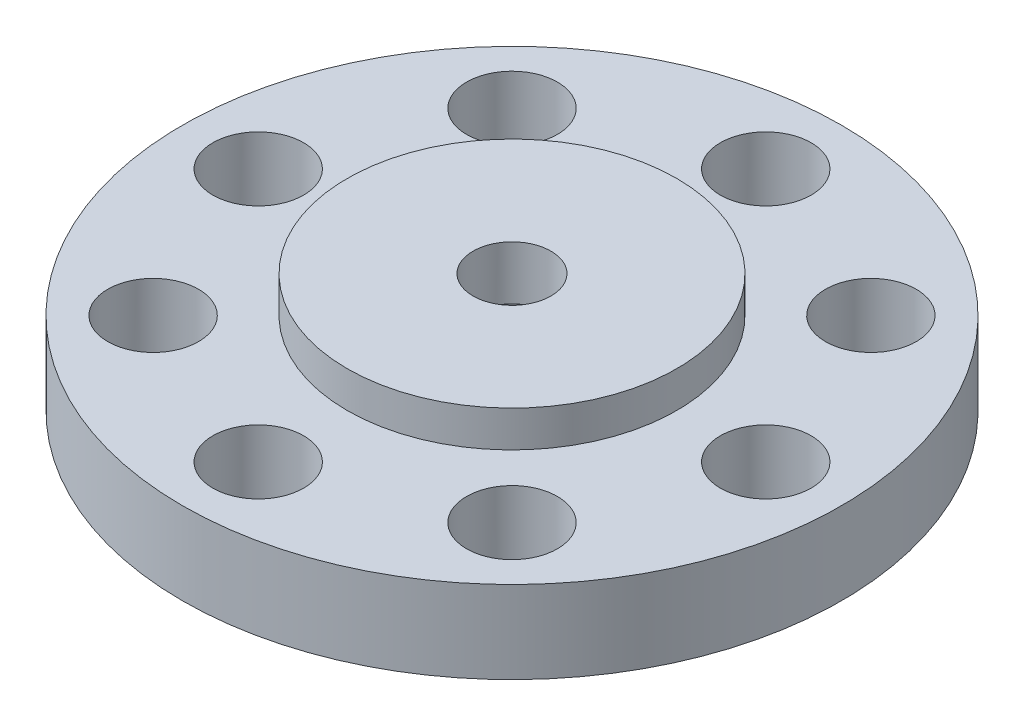
ISO-10303-21;
HEADER;
FILE_DESCRIPTION(('STEP AP214'),'2;1');
FILE_NAME('part.step','',(''),(''),'','','');
FILE_SCHEMA(('AUTOMOTIVE_DESIGN { 1 0 10303 214 1 1 1 1 }'));
ENDSEC;
DATA;
#1=APPLICATION_CONTEXT('core data for automotive mechanical design processes');
#2=APPLICATION_PROTOCOL_DEFINITION('international standard','automotive_design',2000,#1);
#3=PRODUCT_CONTEXT('',#1,'mechanical');
#4=PRODUCT('Part','Part','',(#3));
#5=PRODUCT_RELATED_PRODUCT_CATEGORY('part','',(#4));
#6=PRODUCT_DEFINITION_FORMATION('','',#4);
#7=PRODUCT_DEFINITION_CONTEXT('part definition',#1,'design');
#8=PRODUCT_DEFINITION('design','',#6,#7);
#9=PRODUCT_DEFINITION_SHAPE('','',#8);
#10=(LENGTH_UNIT() NAMED_UNIT(*) SI_UNIT(.MILLI.,.METRE.));
#11=(NAMED_UNIT(*) PLANE_ANGLE_UNIT() SI_UNIT($,.RADIAN.));
#12=(NAMED_UNIT(*) SI_UNIT($,.STERADIAN.) SOLID_ANGLE_UNIT());
#13=UNCERTAINTY_MEASURE_WITH_UNIT(LENGTH_MEASURE(1.E-05),#10,'distance_accuracy_value','');
#14=(GEOMETRIC_REPRESENTATION_CONTEXT(3) GLOBAL_UNCERTAINTY_ASSIGNED_CONTEXT((#13)) GLOBAL_UNIT_ASSIGNED_CONTEXT((#10,
#11,#12)) REPRESENTATION_CONTEXT('',''));
#15=CARTESIAN_POINT('',(0.,0.,0.));
#16=DIRECTION('',(0.,0.,1.));
#17=DIRECTION('',(1.,0.,0.));
#18=AXIS2_PLACEMENT_3D('',#15,#16,#17);
#19=CARTESIAN_POINT('',(0.,-3.175,0.));
#20=DIRECTION('',(0.,1.,0.));
#21=DIRECTION('',(0.,0.,1.));
#22=AXIS2_PLACEMENT_3D('',#19,#20,#21);
#23=CYLINDRICAL_SURFACE('',#22,1.5);
#24=CARTESIAN_POINT('',(0.,1.397,0.));
#25=DIRECTION('',(0.,1.,0.));
#26=DIRECTION('',(0.,0.,1.));
#27=AXIS2_PLACEMENT_3D('',#24,#25,#26);
#28=CIRCLE('',#27,1.5);
#29=CARTESIAN_POINT('',(0.,1.397,1.5));
#30=VERTEX_POINT('',#29);
#31=EDGE_CURVE('E60',#30,#30,#28,.T.);
#32=ORIENTED_EDGE('',*,*,#31,.T.);
#33=EDGE_LOOP('',(#32));
#34=FACE_BOUND('',#33,.T.);
#35=CARTESIAN_POINT('',(0.,-0.675,0.));
#36=DIRECTION('',(0.,-1.,0.));
#37=DIRECTION('',(0.,0.,-1.));
#38=AXIS2_PLACEMENT_3D('',#35,#36,#37);
#39=CIRCLE('',#38,1.5);
#40=CARTESIAN_POINT('',(0.,-0.675,-1.5));
#41=VERTEX_POINT('',#40);
#42=EDGE_CURVE('E43',#41,#41,#39,.F.);
#43=ORIENTED_EDGE('',*,*,#42,.F.);
#44=EDGE_LOOP('',(#43));
#45=FACE_BOUND('',#44,.T.);
#46=ADVANCED_FACE('F39',(#34,#45),#23,.F.);
#47=CARTESIAN_POINT('',(0.,-3.175,0.));
#48=DIRECTION('',(0.,1.,0.));
#49=DIRECTION('',(0.,0.,1.));
#50=AXIS2_PLACEMENT_3D('',#47,#48,#49);
#51=CYLINDRICAL_SURFACE('',#50,12.7);
#52=CARTESIAN_POINT('',(0.,-3.175,0.));
#53=DIRECTION('',(0.,1.,0.));
#54=DIRECTION('',(0.,0.,1.));
#55=AXIS2_PLACEMENT_3D('',#52,#53,#54);
#56=CIRCLE('',#55,12.7);
#57=CARTESIAN_POINT('',(0.,-3.175,12.7));
#58=VERTEX_POINT('',#57);
#59=EDGE_CURVE('E47',#58,#58,#56,.T.);
#60=ORIENTED_EDGE('',*,*,#59,.T.);
#61=EDGE_LOOP('',(#60));
#62=FACE_BOUND('',#61,.T.);
#63=CARTESIAN_POINT('',(0.,0.,0.));
#64=DIRECTION('',(0.,1.,0.));
#65=DIRECTION('',(0.,0.,1.));
#66=AXIS2_PLACEMENT_3D('',#63,#64,#65);
#67=CIRCLE('',#66,12.7);
#68=CARTESIAN_POINT('',(0.,0.,12.7));
#69=VERTEX_POINT('',#68);
#70=EDGE_CURVE('E52',#69,#69,#67,.T.);
#71=ORIENTED_EDGE('',*,*,#70,.F.);
#72=EDGE_LOOP('',(#71));
#73=FACE_BOUND('',#72,.T.);
#74=ADVANCED_FACE('F41',(#62,#73),#51,.T.);
#75=CARTESIAN_POINT('',(0.,-3.175,0.));
#76=DIRECTION('',(0.,1.,0.));
#77=DIRECTION('',(0.,0.,1.));
#78=AXIS2_PLACEMENT_3D('',#75,#76,#77);
#79=PLANE('',#78);
#80=CARTESIAN_POINT('',(0.,-3.175,0.));
#81=DIRECTION('',(0.,-1.,0.));
#82=DIRECTION('',(0.,0.,-1.));
#83=AXIS2_PLACEMENT_3D('',#80,#81,#82);
#84=CIRCLE('',#83,2.5);
#85=CARTESIAN_POINT('',(0.,-3.175,-2.5));
#86=VERTEX_POINT('',#85);
#87=EDGE_CURVE('E113',#86,#86,#84,.T.);
#88=ORIENTED_EDGE('',*,*,#87,.F.);
#89=EDGE_LOOP('',(#88));
#90=FACE_BOUND('',#89,.T.);
#91=CARTESIAN_POINT('',(-9.779,-3.175,0.));
#92=DIRECTION('',(0.,1.,0.));
#93=DIRECTION('',(-1.,0.,0.));
#94=AXIS2_PLACEMENT_3D('',#91,#92,#93);
#95=CIRCLE('',#94,1.75);
#96=CARTESIAN_POINT('',(-11.529,-3.175,0.));
#97=VERTEX_POINT('',#96);
#98=EDGE_CURVE('E95',#97,#97,#95,.T.);
#99=ORIENTED_EDGE('',*,*,#98,.T.);
#100=EDGE_LOOP('',(#99));
#101=FACE_BOUND('',#100,.T.);
#102=CARTESIAN_POINT('',(-6.91479721322321,-3.175,-6.91479721322328));
#103=DIRECTION('',(0.,1.,0.));
#104=DIRECTION('',(-0.707106781186544,0.,-0.707106781186551));
#105=AXIS2_PLACEMENT_3D('',#102,#103,#104);
#106=CIRCLE('',#105,1.75);
#107=CARTESIAN_POINT('',(-8.15223408029966,-3.175,-8.15223408029975));
#108=VERTEX_POINT('',#107);
#109=EDGE_CURVE('E103',#108,#108,#106,.T.);
#110=ORIENTED_EDGE('',*,*,#109,.T.);
#111=EDGE_LOOP('',(#110));
#112=FACE_BOUND('',#111,.T.);
#113=CARTESIAN_POINT('',(0.,-3.175,-9.779));
#114=DIRECTION('',(0.,1.,0.));
#115=DIRECTION('',(0.,0.,-1.));
#116=AXIS2_PLACEMENT_3D('',#113,#114,#115);
#117=CIRCLE('',#116,1.75);
#118=CARTESIAN_POINT('',(0.,-3.175,-11.529));
#119=VERTEX_POINT('',#118);
#120=EDGE_CURVE('E99',#119,#119,#117,.T.);
#121=ORIENTED_EDGE('',*,*,#120,.T.);
#122=EDGE_LOOP('',(#121));
#123=FACE_BOUND('',#122,.T.);
#124=CARTESIAN_POINT('',(6.91479721322331,-3.175,-6.91479721322319));
#125=DIRECTION('',(0.,1.,0.));
#126=DIRECTION('',(0.707106781186554,0.,-0.707106781186541));
#127=AXIS2_PLACEMENT_3D('',#124,#125,#126);
#128=CIRCLE('',#127,1.75);
#129=CARTESIAN_POINT('',(8.15223408029978,-3.175,-8.15223408029964));
#130=VERTEX_POINT('',#129);
#131=EDGE_CURVE('E96',#130,#130,#128,.T.);
#132=ORIENTED_EDGE('',*,*,#131,.T.);
#133=EDGE_LOOP('',(#132));
#134=FACE_BOUND('',#133,.T.);
#135=CARTESIAN_POINT('',(9.779,-3.175,1.02429588037641E-13));
#136=DIRECTION('',(0.,1.,0.));
#137=DIRECTION('',(1.,0.,0.));
#138=AXIS2_PLACEMENT_3D('',#135,#136,#137);
#139=CIRCLE('',#138,1.75);
#140=CARTESIAN_POINT('',(11.529,-3.175,1.20759865066567E-13));
#141=VERTEX_POINT('',#140);
#142=EDGE_CURVE('E100',#141,#141,#139,.T.);
#143=ORIENTED_EDGE('',*,*,#142,.T.);
#144=EDGE_LOOP('',(#143));
#145=FACE_BOUND('',#144,.T.);
#146=CARTESIAN_POINT('',(6.91479721322316,-3.175,6.91479721322333));
#147=DIRECTION('',(0.,1.,0.));
#148=DIRECTION('',(0.707106781186539,0.,0.707106781186556));
#149=AXIS2_PLACEMENT_3D('',#146,#147,#148);
#150=CIRCLE('',#149,1.75);
#151=CARTESIAN_POINT('',(8.15223408029961,-3.175,8.1522340802998));
#152=VERTEX_POINT('',#151);
#153=EDGE_CURVE('E108',#152,#152,#150,.T.);
#154=ORIENTED_EDGE('',*,*,#153,.T.);
#155=EDGE_LOOP('',(#154));
#156=FACE_BOUND('',#155,.T.);
#157=CARTESIAN_POINT('',(-6.91479721322326,-3.175,6.91479721322324));
#158=DIRECTION('',(0.,1.,0.));
#159=DIRECTION('',(-0.707106781186549,0.,0.707106781186546));
#160=AXIS2_PLACEMENT_3D('',#157,#158,#159);
#161=CIRCLE('',#160,1.75);
#162=CARTESIAN_POINT('',(-8.15223408029972,-3.175,8.15223408029969));
#163=VERTEX_POINT('',#162);
#164=EDGE_CURVE('E71',#163,#163,#161,.T.);
#165=ORIENTED_EDGE('',*,*,#164,.T.);
#166=EDGE_LOOP('',(#165));
#167=FACE_BOUND('',#166,.T.);
#168=CARTESIAN_POINT('',(0.,-3.175,9.779));
#169=DIRECTION('',(0.,1.,0.));
#170=DIRECTION('',(0.,0.,1.));
#171=AXIS2_PLACEMENT_3D('',#168,#169,#170);
#172=CIRCLE('',#171,1.75);
#173=CARTESIAN_POINT('',(0.,-3.175,11.529));
#174=VERTEX_POINT('',#173);
#175=EDGE_CURVE('E66',#174,#174,#172,.T.);
#176=ORIENTED_EDGE('',*,*,#175,.T.);
#177=EDGE_LOOP('',(#176));
#178=FACE_BOUND('',#177,.T.);
#179=ORIENTED_EDGE('',*,*,#59,.F.);
#180=EDGE_LOOP('',(#179));
#181=FACE_BOUND('',#180,.T.);
#182=ADVANCED_FACE('F131',(#90,#101,#112,#123,#134,#145,#156,#167,#178,#181),#79,.F.);
#183=CARTESIAN_POINT('',(0.,0.,0.));
#184=DIRECTION('',(0.,1.,0.));
#185=DIRECTION('',(0.,0.,1.));
#186=AXIS2_PLACEMENT_3D('',#183,#184,#185);
#187=PLANE('',#186);
#188=CARTESIAN_POINT('',(-9.779,0.,0.));
#189=DIRECTION('',(0.,1.,0.));
#190=DIRECTION('',(0.,0.,1.));
#191=AXIS2_PLACEMENT_3D('',#188,#189,#190);
#192=CIRCLE('',#191,1.75);
#193=CARTESIAN_POINT('',(-9.779,0.,1.74999999999997));
#194=VERTEX_POINT('',#193);
#195=EDGE_CURVE('E85',#194,#194,#192,.T.);
#196=ORIENTED_EDGE('',*,*,#195,.F.);
#197=EDGE_LOOP('',(#196));
#198=FACE_BOUND('',#197,.T.);
#199=CARTESIAN_POINT('',(-6.91479721322321,0.,-6.91479721322328));
#200=DIRECTION('',(0.,1.,0.));
#201=DIRECTION('',(0.,0.,1.));
#202=AXIS2_PLACEMENT_3D('',#199,#200,#201);
#203=CIRCLE('',#202,1.75);
#204=CARTESIAN_POINT('',(-6.91479721322321,0.,-5.16479721322328));
#205=VERTEX_POINT('',#204);
#206=EDGE_CURVE('E83',#205,#205,#203,.T.);
#207=ORIENTED_EDGE('',*,*,#206,.F.);
#208=EDGE_LOOP('',(#207));
#209=FACE_BOUND('',#208,.T.);
#210=CARTESIAN_POINT('',(0.,0.,-9.779));
#211=DIRECTION('',(0.,1.,0.));
#212=DIRECTION('',(0.,0.,1.));
#213=AXIS2_PLACEMENT_3D('',#210,#211,#212);
#214=CIRCLE('',#213,1.75);
#215=CARTESIAN_POINT('',(0.,0.,-8.029));
#216=VERTEX_POINT('',#215);
#217=EDGE_CURVE('E80',#216,#216,#214,.T.);
#218=ORIENTED_EDGE('',*,*,#217,.F.);
#219=EDGE_LOOP('',(#218));
#220=FACE_BOUND('',#219,.T.);
#221=CARTESIAN_POINT('',(6.91479721322331,0.,-6.91479721322319));
#222=DIRECTION('',(0.,1.,0.));
#223=DIRECTION('',(0.,0.,1.));
#224=AXIS2_PLACEMENT_3D('',#221,#222,#223);
#225=CIRCLE('',#224,1.75);
#226=CARTESIAN_POINT('',(6.91479721322331,0.,-5.16479721322319));
#227=VERTEX_POINT('',#226);
#228=EDGE_CURVE('E77',#227,#227,#225,.T.);
#229=ORIENTED_EDGE('',*,*,#228,.F.);
#230=EDGE_LOOP('',(#229));
#231=FACE_BOUND('',#230,.T.);
#232=CARTESIAN_POINT('',(9.779,0.,1.02429588037641E-13));
#233=DIRECTION('',(0.,1.,0.));
#234=DIRECTION('',(0.,0.,1.));
#235=AXIS2_PLACEMENT_3D('',#232,#233,#234);
#236=CIRCLE('',#235,1.75);
#237=CARTESIAN_POINT('',(9.779,0.,1.7500000000001));
#238=VERTEX_POINT('',#237);
#239=EDGE_CURVE('E74',#238,#238,#236,.T.);
#240=ORIENTED_EDGE('',*,*,#239,.F.);
#241=EDGE_LOOP('',(#240));
#242=FACE_BOUND('',#241,.T.);
#243=CARTESIAN_POINT('',(6.91479721322316,0.,6.91479721322333));
#244=DIRECTION('',(0.,1.,0.));
#245=DIRECTION('',(0.,0.,1.));
#246=AXIS2_PLACEMENT_3D('',#243,#244,#245);
#247=CIRCLE('',#246,1.75);
#248=CARTESIAN_POINT('',(6.91479721322316,0.,8.66479721322333));
#249=VERTEX_POINT('',#248);
#250=EDGE_CURVE('E70',#249,#249,#247,.T.);
#251=ORIENTED_EDGE('',*,*,#250,.F.);
#252=EDGE_LOOP('',(#251));
#253=FACE_BOUND('',#252,.T.);
#254=CARTESIAN_POINT('',(-6.91479721322326,0.,6.91479721322324));
#255=DIRECTION('',(0.,1.,0.));
#256=DIRECTION('',(0.,0.,1.));
#257=AXIS2_PLACEMENT_3D('',#254,#255,#256);
#258=CIRCLE('',#257,1.75);
#259=CARTESIAN_POINT('',(-6.91479721322326,0.,8.66479721322324));
#260=VERTEX_POINT('',#259);
#261=EDGE_CURVE('E67',#260,#260,#258,.T.);
#262=ORIENTED_EDGE('',*,*,#261,.F.);
#263=EDGE_LOOP('',(#262));
#264=FACE_BOUND('',#263,.T.);
#265=CARTESIAN_POINT('',(0.,0.,9.779));
#266=DIRECTION('',(0.,1.,0.));
#267=DIRECTION('',(0.,0.,1.));
#268=AXIS2_PLACEMENT_3D('',#265,#266,#267);
#269=CIRCLE('',#268,1.75);
#270=CARTESIAN_POINT('',(0.,0.,11.529));
#271=VERTEX_POINT('',#270);
#272=EDGE_CURVE('E63',#271,#271,#269,.T.);
#273=ORIENTED_EDGE('',*,*,#272,.F.);
#274=EDGE_LOOP('',(#273));
#275=FACE_BOUND('',#274,.T.);
#276=CARTESIAN_POINT('',(0.,0.,0.));
#277=DIRECTION('',(0.,1.,0.));
#278=DIRECTION('',(0.,0.,1.));
#279=AXIS2_PLACEMENT_3D('',#276,#277,#278);
#280=CIRCLE('',#279,6.35);
#281=CARTESIAN_POINT('',(0.,0.,6.35));
#282=VERTEX_POINT('',#281);
#283=EDGE_CURVE('E11',#282,#282,#280,.T.);
#284=ORIENTED_EDGE('',*,*,#283,.F.);
#285=EDGE_LOOP('',(#284));
#286=FACE_BOUND('',#285,.T.);
#287=ORIENTED_EDGE('',*,*,#70,.T.);
#288=EDGE_LOOP('',(#287));
#289=FACE_BOUND('',#288,.T.);
#290=ADVANCED_FACE('F144',(#198,#209,#220,#231,#242,#253,#264,#275,#286,#289),#187,.T.);
#291=CARTESIAN_POINT('',(0.,1.397,0.));
#292=DIRECTION('',(0.,-1.,0.));
#293=DIRECTION('',(0.,0.,-1.));
#294=AXIS2_PLACEMENT_3D('',#291,#292,#293);
#295=CYLINDRICAL_SURFACE('',#294,6.35);
#296=CARTESIAN_POINT('',(0.,1.397,0.));
#297=DIRECTION('',(0.,1.,0.));
#298=DIRECTION('',(0.,0.,1.));
#299=AXIS2_PLACEMENT_3D('',#296,#297,#298);
#300=CIRCLE('',#299,6.35);
#301=CARTESIAN_POINT('',(0.,1.397,6.35));
#302=VERTEX_POINT('',#301);
#303=EDGE_CURVE('E55',#302,#302,#300,.T.);
#304=ORIENTED_EDGE('',*,*,#303,.F.);
#305=EDGE_LOOP('',(#304));
#306=FACE_BOUND('',#305,.T.);
#307=ORIENTED_EDGE('',*,*,#283,.T.);
#308=EDGE_LOOP('',(#307));
#309=FACE_BOUND('',#308,.T.);
#310=ADVANCED_FACE('F140',(#306,#309),#295,.T.);
#311=CARTESIAN_POINT('',(0.,1.397,0.));
#312=DIRECTION('',(0.,1.,0.));
#313=DIRECTION('',(0.,0.,1.));
#314=AXIS2_PLACEMENT_3D('',#311,#312,#313);
#315=PLANE('',#314);
#316=ORIENTED_EDGE('',*,*,#31,.F.);
#317=EDGE_LOOP('',(#316));
#318=FACE_BOUND('',#317,.T.);
#319=ORIENTED_EDGE('',*,*,#303,.T.);
#320=EDGE_LOOP('',(#319));
#321=FACE_BOUND('',#320,.T.);
#322=ADVANCED_FACE('F137',(#318,#321),#315,.T.);
#323=CARTESIAN_POINT('',(0.,-3.175,9.779));
#324=DIRECTION('',(0.,1.,0.));
#325=DIRECTION('',(0.,0.,1.));
#326=AXIS2_PLACEMENT_3D('',#323,#324,#325);
#327=CYLINDRICAL_SURFACE('',#326,1.75);
#328=ORIENTED_EDGE('',*,*,#272,.T.);
#329=EDGE_LOOP('',(#328));
#330=FACE_BOUND('',#329,.T.);
#331=ORIENTED_EDGE('',*,*,#175,.F.);
#332=EDGE_LOOP('',(#331));
#333=FACE_BOUND('',#332,.T.);
#334=ADVANCED_FACE('F135',(#330,#333),#327,.F.);
#335=CARTESIAN_POINT('',(-6.91479721322326,-3.175,6.91479721322324));
#336=DIRECTION('',(0.,1.,0.));
#337=DIRECTION('',(0.,0.,1.));
#338=AXIS2_PLACEMENT_3D('',#335,#336,#337);
#339=CYLINDRICAL_SURFACE('',#338,1.75);
#340=ORIENTED_EDGE('',*,*,#261,.T.);
#341=EDGE_LOOP('',(#340));
#342=FACE_BOUND('',#341,.T.);
#343=ORIENTED_EDGE('',*,*,#164,.F.);
#344=EDGE_LOOP('',(#343));
#345=FACE_BOUND('',#344,.T.);
#346=ADVANCED_FACE('F173',(#342,#345),#339,.F.);
#347=CARTESIAN_POINT('',(6.91479721322316,-3.175,6.91479721322333));
#348=DIRECTION('',(0.,1.,0.));
#349=DIRECTION('',(0.,0.,1.));
#350=AXIS2_PLACEMENT_3D('',#347,#348,#349);
#351=CYLINDRICAL_SURFACE('',#350,1.75);
#352=ORIENTED_EDGE('',*,*,#250,.T.);
#353=EDGE_LOOP('',(#352));
#354=FACE_BOUND('',#353,.T.);
#355=ORIENTED_EDGE('',*,*,#153,.F.);
#356=EDGE_LOOP('',(#355));
#357=FACE_BOUND('',#356,.T.);
#358=ADVANCED_FACE('F177',(#354,#357),#351,.F.);
#359=CARTESIAN_POINT('',(9.779,-3.175,1.02429588037641E-13));
#360=DIRECTION('',(0.,1.,0.));
#361=DIRECTION('',(0.,0.,1.));
#362=AXIS2_PLACEMENT_3D('',#359,#360,#361);
#363=CYLINDRICAL_SURFACE('',#362,1.75);
#364=ORIENTED_EDGE('',*,*,#239,.T.);
#365=EDGE_LOOP('',(#364));
#366=FACE_BOUND('',#365,.T.);
#367=ORIENTED_EDGE('',*,*,#142,.F.);
#368=EDGE_LOOP('',(#367));
#369=FACE_BOUND('',#368,.T.);
#370=ADVANCED_FACE('F182',(#366,#369),#363,.F.);
#371=CARTESIAN_POINT('',(6.91479721322331,-3.175,-6.91479721322319));
#372=DIRECTION('',(0.,1.,0.));
#373=DIRECTION('',(0.,0.,1.));
#374=AXIS2_PLACEMENT_3D('',#371,#372,#373);
#375=CYLINDRICAL_SURFACE('',#374,1.75);
#376=ORIENTED_EDGE('',*,*,#228,.T.);
#377=EDGE_LOOP('',(#376));
#378=FACE_BOUND('',#377,.T.);
#379=ORIENTED_EDGE('',*,*,#131,.F.);
#380=EDGE_LOOP('',(#379));
#381=FACE_BOUND('',#380,.T.);
#382=ADVANCED_FACE('F187',(#378,#381),#375,.F.);
#383=CARTESIAN_POINT('',(0.,-3.175,-9.779));
#384=DIRECTION('',(0.,1.,0.));
#385=DIRECTION('',(0.,0.,1.));
#386=AXIS2_PLACEMENT_3D('',#383,#384,#385);
#387=CYLINDRICAL_SURFACE('',#386,1.75);
#388=ORIENTED_EDGE('',*,*,#217,.T.);
#389=EDGE_LOOP('',(#388));
#390=FACE_BOUND('',#389,.T.);
#391=ORIENTED_EDGE('',*,*,#120,.F.);
#392=EDGE_LOOP('',(#391));
#393=FACE_BOUND('',#392,.T.);
#394=ADVANCED_FACE('F190',(#390,#393),#387,.F.);
#395=CARTESIAN_POINT('',(-6.91479721322321,-3.175,-6.91479721322328));
#396=DIRECTION('',(0.,1.,0.));
#397=DIRECTION('',(0.,0.,1.));
#398=AXIS2_PLACEMENT_3D('',#395,#396,#397);
#399=CYLINDRICAL_SURFACE('',#398,1.75);
#400=ORIENTED_EDGE('',*,*,#206,.T.);
#401=EDGE_LOOP('',(#400));
#402=FACE_BOUND('',#401,.T.);
#403=ORIENTED_EDGE('',*,*,#109,.F.);
#404=EDGE_LOOP('',(#403));
#405=FACE_BOUND('',#404,.T.);
#406=ADVANCED_FACE('F194',(#402,#405),#399,.F.);
#407=CARTESIAN_POINT('',(-9.779,-3.175,0.));
#408=DIRECTION('',(0.,1.,0.));
#409=DIRECTION('',(0.,0.,1.));
#410=AXIS2_PLACEMENT_3D('',#407,#408,#409);
#411=CYLINDRICAL_SURFACE('',#410,1.75);
#412=ORIENTED_EDGE('',*,*,#195,.T.);
#413=EDGE_LOOP('',(#412));
#414=FACE_BOUND('',#413,.T.);
#415=ORIENTED_EDGE('',*,*,#98,.F.);
#416=EDGE_LOOP('',(#415));
#417=FACE_BOUND('',#416,.T.);
#418=ADVANCED_FACE('F198',(#414,#417),#411,.F.);
#419=CARTESIAN_POINT('',(0.,-0.675,0.));
#420=DIRECTION('',(0.,-1.,0.));
#421=DIRECTION('',(0.,0.,-1.));
#422=AXIS2_PLACEMENT_3D('',#419,#420,#421);
#423=PLANE('',#422);
#424=CARTESIAN_POINT('',(0.,-0.675,0.));
#425=DIRECTION('',(0.,-1.,0.));
#426=DIRECTION('',(0.,0.,-1.));
#427=AXIS2_PLACEMENT_3D('',#424,#425,#426);
#428=CIRCLE('',#427,2.5);
#429=CARTESIAN_POINT('',(0.,-0.675,-2.5));
#430=VERTEX_POINT('',#429);
#431=EDGE_CURVE('E116',#430,#430,#428,.T.);
#432=ORIENTED_EDGE('',*,*,#431,.T.);
#433=EDGE_LOOP('',(#432));
#434=FACE_BOUND('',#433,.T.);
#435=ORIENTED_EDGE('',*,*,#42,.T.);
#436=EDGE_LOOP('',(#435));
#437=FACE_BOUND('',#436,.T.);
#438=ADVANCED_FACE('F123',(#434,#437),#423,.T.);
#439=CARTESIAN_POINT('',(0.,-0.675,0.));
#440=DIRECTION('',(0.,-1.,0.));
#441=DIRECTION('',(0.,0.,-1.));
#442=AXIS2_PLACEMENT_3D('',#439,#440,#441);
#443=CYLINDRICAL_SURFACE('',#442,2.5);
#444=ORIENTED_EDGE('',*,*,#431,.F.);
#445=EDGE_LOOP('',(#444));
#446=FACE_BOUND('',#445,.T.);
#447=ORIENTED_EDGE('',*,*,#87,.T.);
#448=EDGE_LOOP('',(#447));
#449=FACE_BOUND('',#448,.T.);
#450=ADVANCED_FACE('F205',(#446,#449),#443,.F.);
#451=CLOSED_SHELL('',(#46,#74,#182,#290,#310,#322,#334,#346,#358,#370,#382,#394,#406,#418,#438,#450));
#452=MANIFOLD_SOLID_BREP('B2',#451);
#453=ADVANCED_BREP_SHAPE_REPRESENTATION('',(#18,#452),#14);
#454=SHAPE_DEFINITION_REPRESENTATION(#9,#453);
ENDSEC;
END-ISO-10303-21;
